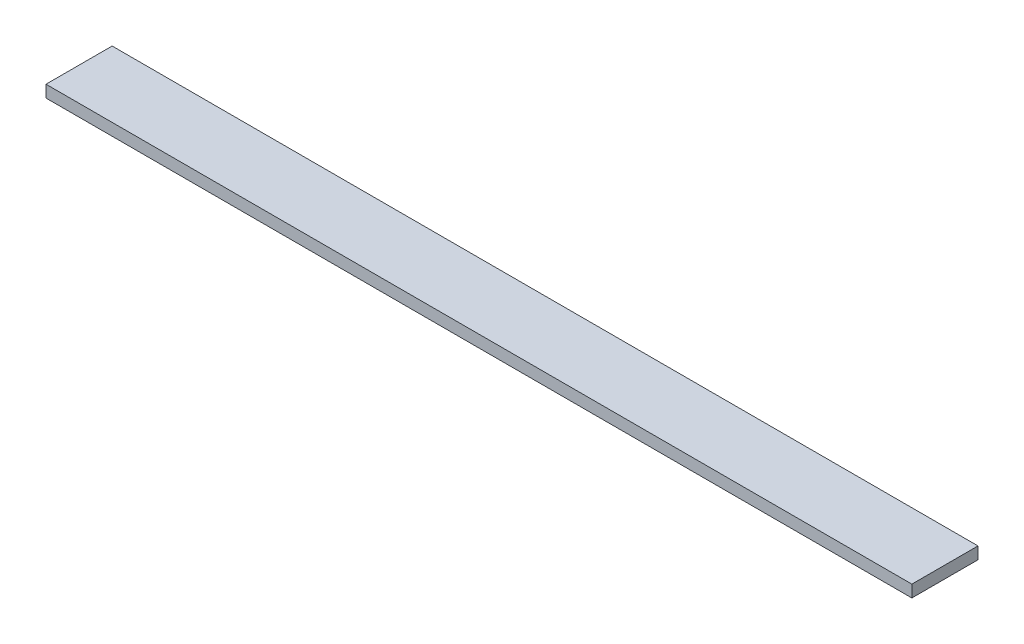
ISO-10303-21;
HEADER;
FILE_DESCRIPTION(('STEP AP214'),'2;1');
FILE_NAME('part.step','',(''),(''),'','','');
FILE_SCHEMA(('AUTOMOTIVE_DESIGN { 1 0 10303 214 1 1 1 1 }'));
ENDSEC;
DATA;
#1=APPLICATION_CONTEXT('core data for automotive mechanical design processes');
#2=APPLICATION_PROTOCOL_DEFINITION('international standard','automotive_design',2000,#1);
#3=PRODUCT_CONTEXT('',#1,'mechanical');
#4=PRODUCT('Part','Part','',(#3));
#5=PRODUCT_RELATED_PRODUCT_CATEGORY('part','',(#4));
#6=PRODUCT_DEFINITION_FORMATION('','',#4);
#7=PRODUCT_DEFINITION_CONTEXT('part definition',#1,'design');
#8=PRODUCT_DEFINITION('design','',#6,#7);
#9=PRODUCT_DEFINITION_SHAPE('','',#8);
#10=(LENGTH_UNIT() NAMED_UNIT(*) SI_UNIT(.MILLI.,.METRE.));
#11=(NAMED_UNIT(*) PLANE_ANGLE_UNIT() SI_UNIT($,.RADIAN.));
#12=(NAMED_UNIT(*) SI_UNIT($,.STERADIAN.) SOLID_ANGLE_UNIT());
#13=UNCERTAINTY_MEASURE_WITH_UNIT(LENGTH_MEASURE(1.E-05),#10,'distance_accuracy_value','');
#14=(GEOMETRIC_REPRESENTATION_CONTEXT(3) GLOBAL_UNCERTAINTY_ASSIGNED_CONTEXT((#13)) GLOBAL_UNIT_ASSIGNED_CONTEXT((#10,
#11,#12)) REPRESENTATION_CONTEXT('',''));
#15=CARTESIAN_POINT('',(0.,0.,0.));
#16=DIRECTION('',(0.,0.,1.));
#17=DIRECTION('',(1.,0.,0.));
#18=AXIS2_PLACEMENT_3D('',#15,#16,#17);
#19=CARTESIAN_POINT('',(914.4,25.4,69.85));
#20=DIRECTION('',(-1.,0.,0.));
#21=DIRECTION('',(0.,0.,1.));
#22=AXIS2_PLACEMENT_3D('',#19,#20,#21);
#23=PLANE('',#22);
#24=DIRECTION('',(0.,0.,-1.));
#25=VECTOR('',#24,1.);
#26=CARTESIAN_POINT('',(914.4,0.,69.85));
#27=LINE('',#26,#25);
#28=CARTESIAN_POINT('',(914.4,0.,69.85));
#29=VERTEX_POINT('',#28);
#30=CARTESIAN_POINT('',(914.4,0.,-69.85));
#31=VERTEX_POINT('',#30);
#32=EDGE_CURVE('E102',#29,#31,#27,.T.);
#33=ORIENTED_EDGE('',*,*,#32,.T.);
#34=DIRECTION('',(0.,-1.,0.));
#35=VECTOR('',#34,1.);
#36=CARTESIAN_POINT('',(914.4,25.4,-69.85));
#37=LINE('',#36,#35);
#38=CARTESIAN_POINT('',(914.4,25.4,-69.85));
#39=VERTEX_POINT('',#38);
#40=EDGE_CURVE('E11',#39,#31,#37,.T.);
#41=ORIENTED_EDGE('',*,*,#40,.F.);
#42=DIRECTION('',(0.,0.,-1.));
#43=VECTOR('',#42,1.);
#44=CARTESIAN_POINT('',(914.4,25.4,69.85));
#45=LINE('',#44,#43);
#46=CARTESIAN_POINT('',(914.4,25.4,69.85));
#47=VERTEX_POINT('',#46);
#48=EDGE_CURVE('E90',#47,#39,#45,.T.);
#49=ORIENTED_EDGE('',*,*,#48,.F.);
#50=DIRECTION('',(0.,-1.,0.));
#51=VECTOR('',#50,1.);
#52=CARTESIAN_POINT('',(914.4,25.4,69.85));
#53=LINE('',#52,#51);
#54=EDGE_CURVE('E98',#47,#29,#53,.T.);
#55=ORIENTED_EDGE('',*,*,#54,.T.);
#56=EDGE_LOOP('',(#33,#41,#49,#55));
#57=FACE_BOUND('',#56,.T.);
#58=ADVANCED_FACE('F39',(#57),#23,.F.);
#59=CARTESIAN_POINT('',(-914.4,25.4,-69.85));
#60=DIRECTION('',(0.,0.,1.));
#61=DIRECTION('',(1.,0.,0.));
#62=AXIS2_PLACEMENT_3D('',#59,#60,#61);
#63=PLANE('',#62);
#64=DIRECTION('',(-1.,0.,0.));
#65=VECTOR('',#64,1.);
#66=CARTESIAN_POINT('',(-914.4,0.,-69.85));
#67=LINE('',#66,#65);
#68=CARTESIAN_POINT('',(-914.4,0.,-69.85));
#69=VERTEX_POINT('',#68);
#70=EDGE_CURVE('E94',#31,#69,#67,.T.);
#71=ORIENTED_EDGE('',*,*,#70,.T.);
#72=DIRECTION('',(0.,-1.,0.));
#73=VECTOR('',#72,1.);
#74=CARTESIAN_POINT('',(-914.4,25.4,-69.85));
#75=LINE('',#74,#73);
#76=CARTESIAN_POINT('',(-914.4,25.4,-69.85));
#77=VERTEX_POINT('',#76);
#78=EDGE_CURVE('E47',#77,#69,#75,.T.);
#79=ORIENTED_EDGE('',*,*,#78,.F.);
#80=DIRECTION('',(-1.,0.,0.));
#81=VECTOR('',#80,1.);
#82=CARTESIAN_POINT('',(-914.4,25.4,-69.85));
#83=LINE('',#82,#81);
#84=EDGE_CURVE('E85',#39,#77,#83,.T.);
#85=ORIENTED_EDGE('',*,*,#84,.F.);
#86=ORIENTED_EDGE('',*,*,#40,.T.);
#87=EDGE_LOOP('',(#71,#79,#85,#86));
#88=FACE_BOUND('',#87,.T.);
#89=ADVANCED_FACE('F93',(#88),#63,.F.);
#90=CARTESIAN_POINT('',(-914.4,25.4,69.85));
#91=DIRECTION('',(1.,0.,0.));
#92=DIRECTION('',(0.,0.,-1.));
#93=AXIS2_PLACEMENT_3D('',#90,#91,#92);
#94=PLANE('',#93);
#95=DIRECTION('',(0.,0.,1.));
#96=VECTOR('',#95,1.);
#97=CARTESIAN_POINT('',(-914.4,0.,69.85));
#98=LINE('',#97,#96);
#99=CARTESIAN_POINT('',(-914.4,0.,69.85));
#100=VERTEX_POINT('',#99);
#101=EDGE_CURVE('E72',#69,#100,#98,.T.);
#102=ORIENTED_EDGE('',*,*,#101,.T.);
#103=DIRECTION('',(0.,-1.,0.));
#104=VECTOR('',#103,1.);
#105=CARTESIAN_POINT('',(-914.4,25.4,69.85));
#106=LINE('',#105,#104);
#107=CARTESIAN_POINT('',(-914.4,25.4,69.85));
#108=VERTEX_POINT('',#107);
#109=EDGE_CURVE('E95',#108,#100,#106,.T.);
#110=ORIENTED_EDGE('',*,*,#109,.F.);
#111=DIRECTION('',(0.,0.,1.));
#112=VECTOR('',#111,1.);
#113=CARTESIAN_POINT('',(-914.4,25.4,69.85));
#114=LINE('',#113,#112);
#115=EDGE_CURVE('E88',#77,#108,#114,.T.);
#116=ORIENTED_EDGE('',*,*,#115,.F.);
#117=ORIENTED_EDGE('',*,*,#78,.T.);
#118=EDGE_LOOP('',(#102,#110,#116,#117));
#119=FACE_BOUND('',#118,.T.);
#120=ADVANCED_FACE('F96',(#119),#94,.F.);
#121=CARTESIAN_POINT('',(-914.4,25.4,69.85));
#122=DIRECTION('',(0.,0.,-1.));
#123=DIRECTION('',(-1.,0.,0.));
#124=AXIS2_PLACEMENT_3D('',#121,#122,#123);
#125=PLANE('',#124);
#126=DIRECTION('',(1.,0.,0.));
#127=VECTOR('',#126,1.);
#128=CARTESIAN_POINT('',(-914.4,0.,69.85));
#129=LINE('',#128,#127);
#130=EDGE_CURVE('E78',#100,#29,#129,.T.);
#131=ORIENTED_EDGE('',*,*,#130,.T.);
#132=ORIENTED_EDGE('',*,*,#54,.F.);
#133=DIRECTION('',(1.,0.,0.));
#134=VECTOR('',#133,1.);
#135=CARTESIAN_POINT('',(-914.4,25.4,69.85));
#136=LINE('',#135,#134);
#137=EDGE_CURVE('E55',#108,#47,#136,.T.);
#138=ORIENTED_EDGE('',*,*,#137,.F.);
#139=ORIENTED_EDGE('',*,*,#109,.T.);
#140=EDGE_LOOP('',(#131,#132,#138,#139));
#141=FACE_BOUND('',#140,.T.);
#142=ADVANCED_FACE('F109',(#141),#125,.F.);
#143=CARTESIAN_POINT('',(0.,25.4,0.));
#144=DIRECTION('',(0.,-1.,0.));
#145=DIRECTION('',(0.,0.,-1.));
#146=AXIS2_PLACEMENT_3D('',#143,#144,#145);
#147=PLANE('',#146);
#148=ORIENTED_EDGE('',*,*,#48,.T.);
#149=ORIENTED_EDGE('',*,*,#84,.T.);
#150=ORIENTED_EDGE('',*,*,#115,.T.);
#151=ORIENTED_EDGE('',*,*,#137,.T.);
#152=EDGE_LOOP('',(#148,#149,#150,#151));
#153=FACE_BOUND('',#152,.T.);
#154=ADVANCED_FACE('F86',(#153),#147,.F.);
#155=CARTESIAN_POINT('',(0.,0.,0.));
#156=DIRECTION('',(0.,-1.,0.));
#157=DIRECTION('',(0.,0.,-1.));
#158=AXIS2_PLACEMENT_3D('',#155,#156,#157);
#159=PLANE('',#158);
#160=ORIENTED_EDGE('',*,*,#32,.F.);
#161=ORIENTED_EDGE('',*,*,#130,.F.);
#162=ORIENTED_EDGE('',*,*,#101,.F.);
#163=ORIENTED_EDGE('',*,*,#70,.F.);
#164=EDGE_LOOP('',(#160,#161,#162,#163));
#165=FACE_BOUND('',#164,.T.);
#166=ADVANCED_FACE('F112',(#165),#159,.T.);
#167=CLOSED_SHELL('',(#58,#89,#120,#142,#154,#166));
#168=MANIFOLD_SOLID_BREP('B2',#167);
#169=ADVANCED_BREP_SHAPE_REPRESENTATION('',(#18,#168),#14);
#170=SHAPE_DEFINITION_REPRESENTATION(#9,#169);
ENDSEC;
END-ISO-10303-21;
